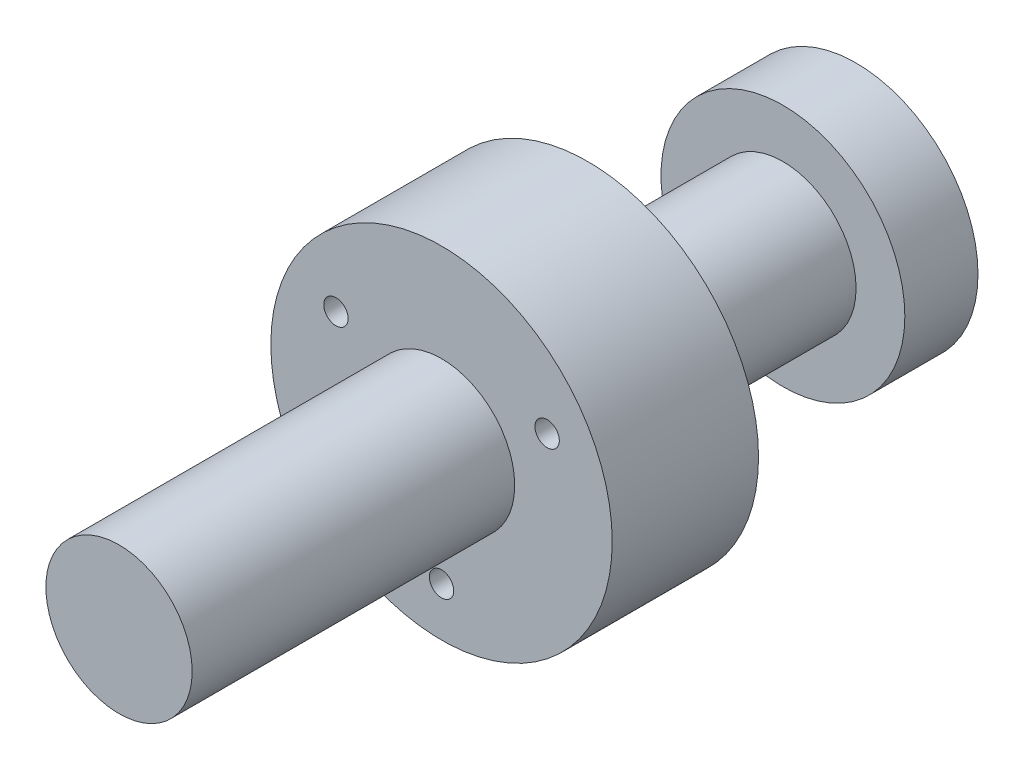
ISO-10303-21;
HEADER;
FILE_DESCRIPTION(('STEP AP214'),'2;1');
FILE_NAME('part.step','',(''),(''),'','','');
FILE_SCHEMA(('AUTOMOTIVE_DESIGN { 1 0 10303 214 1 1 1 1 }'));
ENDSEC;
DATA;
#1=APPLICATION_CONTEXT('core data for automotive mechanical design processes');
#2=APPLICATION_PROTOCOL_DEFINITION('international standard','automotive_design',2000,#1);
#3=PRODUCT_CONTEXT('',#1,'mechanical');
#4=PRODUCT('Part','Part','',(#3));
#5=PRODUCT_RELATED_PRODUCT_CATEGORY('part','',(#4));
#6=PRODUCT_DEFINITION_FORMATION('','',#4);
#7=PRODUCT_DEFINITION_CONTEXT('part definition',#1,'design');
#8=PRODUCT_DEFINITION('design','',#6,#7);
#9=PRODUCT_DEFINITION_SHAPE('','',#8);
#10=(LENGTH_UNIT() NAMED_UNIT(*) SI_UNIT(.MILLI.,.METRE.));
#11=(NAMED_UNIT(*) PLANE_ANGLE_UNIT() SI_UNIT($,.RADIAN.));
#12=(NAMED_UNIT(*) SI_UNIT($,.STERADIAN.) SOLID_ANGLE_UNIT());
#13=UNCERTAINTY_MEASURE_WITH_UNIT(LENGTH_MEASURE(1.E-05),#10,'distance_accuracy_value','');
#14=(GEOMETRIC_REPRESENTATION_CONTEXT(3) GLOBAL_UNCERTAINTY_ASSIGNED_CONTEXT((#13)) GLOBAL_UNIT_ASSIGNED_CONTEXT((#10,
#11,#12)) REPRESENTATION_CONTEXT('',''));
#15=CARTESIAN_POINT('',(0.,0.,0.));
#16=DIRECTION('',(0.,0.,1.));
#17=DIRECTION('',(1.,0.,0.));
#18=AXIS2_PLACEMENT_3D('',#15,#16,#17);
#19=CARTESIAN_POINT('',(0.,0.,33.5));
#20=DIRECTION('',(0.,0.,1.));
#21=DIRECTION('',(1.,0.,0.));
#22=AXIS2_PLACEMENT_3D('',#19,#20,#21);
#23=CYLINDRICAL_SURFACE('',#22,3.49999999999988);
#24=CARTESIAN_POINT('',(0.,0.,33.5));
#25=DIRECTION('',(0.,0.,1.));
#26=DIRECTION('',(1.,0.,0.));
#27=AXIS2_PLACEMENT_3D('',#24,#25,#26);
#28=CIRCLE('',#27,3.49999999999988);
#29=CARTESIAN_POINT('',(3.49999999999988,0.,33.5));
#30=VERTEX_POINT('',#29);
#31=EDGE_CURVE('E46',#30,#30,#28,.T.);
#32=ORIENTED_EDGE('',*,*,#31,.T.);
#33=EDGE_LOOP('',(#32));
#34=FACE_BOUND('',#33,.T.);
#35=CARTESIAN_POINT('',(0.,0.,36.5));
#36=DIRECTION('',(0.,0.,1.));
#37=DIRECTION('',(1.,0.,0.));
#38=AXIS2_PLACEMENT_3D('',#35,#36,#37);
#39=CIRCLE('',#38,3.49999999999988);
#40=CARTESIAN_POINT('',(3.49999999999988,0.,36.5));
#41=VERTEX_POINT('',#40);
#42=EDGE_CURVE('E51',#41,#41,#39,.T.);
#43=ORIENTED_EDGE('',*,*,#42,.F.);
#44=EDGE_LOOP('',(#43));
#45=FACE_BOUND('',#44,.T.);
#46=ADVANCED_FACE('F39',(#34,#45),#23,.T.);
#47=CARTESIAN_POINT('',(0.,0.,33.5));
#48=DIRECTION('',(0.,0.,1.));
#49=DIRECTION('',(1.,0.,0.));
#50=AXIS2_PLACEMENT_3D('',#47,#48,#49);
#51=PLANE('',#50);
#52=CARTESIAN_POINT('',(0.,-2.5,33.5));
#53=DIRECTION('',(0.,0.,1.));
#54=DIRECTION('',(1.,0.,0.));
#55=AXIS2_PLACEMENT_3D('',#52,#53,#54);
#56=CIRCLE('',#55,0.25);
#57=CARTESIAN_POINT('',(0.25,-2.5,33.5));
#58=VERTEX_POINT('',#57);
#59=EDGE_CURVE('E75',#58,#58,#56,.F.);
#60=ORIENTED_EDGE('',*,*,#59,.F.);
#61=EDGE_LOOP('',(#60));
#62=FACE_BOUND('',#61,.T.);
#63=CARTESIAN_POINT('',(-2.16506350946109,1.25000000000001,33.5));
#64=DIRECTION('',(0.,0.,1.));
#65=DIRECTION('',(1.,0.,0.));
#66=AXIS2_PLACEMENT_3D('',#63,#64,#65);
#67=CIRCLE('',#66,0.25);
#68=CARTESIAN_POINT('',(-1.91506350946109,1.25000000000001,33.5));
#69=VERTEX_POINT('',#68);
#70=EDGE_CURVE('E80',#69,#69,#67,.F.);
#71=ORIENTED_EDGE('',*,*,#70,.F.);
#72=EDGE_LOOP('',(#71));
#73=FACE_BOUND('',#72,.T.);
#74=CARTESIAN_POINT('',(2.16506350946111,1.24999999999998,33.5));
#75=DIRECTION('',(0.,0.,1.));
#76=DIRECTION('',(1.,0.,0.));
#77=AXIS2_PLACEMENT_3D('',#74,#75,#76);
#78=CIRCLE('',#77,0.250000000000001);
#79=CARTESIAN_POINT('',(2.41506350946111,1.24999999999998,33.5));
#80=VERTEX_POINT('',#79);
#81=EDGE_CURVE('E81',#80,#80,#78,.F.);
#82=ORIENTED_EDGE('',*,*,#81,.F.);
#83=EDGE_LOOP('',(#82));
#84=FACE_BOUND('',#83,.T.);
#85=CARTESIAN_POINT('',(0.,0.,33.5));
#86=DIRECTION('',(0.,0.,1.));
#87=DIRECTION('',(1.,0.,0.));
#88=AXIS2_PLACEMENT_3D('',#85,#86,#87);
#89=CIRCLE('',#88,1.5);
#90=CARTESIAN_POINT('',(1.5,0.,33.5));
#91=VERTEX_POINT('',#90);
#92=EDGE_CURVE('E10',#91,#91,#89,.F.);
#93=ORIENTED_EDGE('',*,*,#92,.F.);
#94=EDGE_LOOP('',(#93));
#95=FACE_BOUND('',#94,.T.);
#96=ORIENTED_EDGE('',*,*,#31,.F.);
#97=EDGE_LOOP('',(#96));
#98=FACE_BOUND('',#97,.T.);
#99=ADVANCED_FACE('F101',(#62,#73,#84,#95,#98),#51,.F.);
#100=CARTESIAN_POINT('',(0.,0.,36.5));
#101=DIRECTION('',(0.,0.,1.));
#102=DIRECTION('',(1.,0.,0.));
#103=AXIS2_PLACEMENT_3D('',#100,#101,#102);
#104=PLANE('',#103);
#105=CARTESIAN_POINT('',(0.,-2.5,36.5));
#106=DIRECTION('',(0.,0.,1.));
#107=DIRECTION('',(1.,0.,0.));
#108=AXIS2_PLACEMENT_3D('',#105,#106,#107);
#109=CIRCLE('',#108,0.25);
#110=CARTESIAN_POINT('',(0.25,-2.5,36.5));
#111=VERTEX_POINT('',#110);
#112=EDGE_CURVE('E87',#111,#111,#109,.T.);
#113=ORIENTED_EDGE('',*,*,#112,.F.);
#114=EDGE_LOOP('',(#113));
#115=FACE_BOUND('',#114,.T.);
#116=CARTESIAN_POINT('',(-2.16506350946109,1.25000000000001,36.5));
#117=DIRECTION('',(0.,0.,1.));
#118=DIRECTION('',(1.,0.,0.));
#119=AXIS2_PLACEMENT_3D('',#116,#117,#118);
#120=CIRCLE('',#119,0.25);
#121=CARTESIAN_POINT('',(-1.91506350946109,1.25000000000001,36.5));
#122=VERTEX_POINT('',#121);
#123=EDGE_CURVE('E84',#122,#122,#120,.T.);
#124=ORIENTED_EDGE('',*,*,#123,.F.);
#125=EDGE_LOOP('',(#124));
#126=FACE_BOUND('',#125,.T.);
#127=CARTESIAN_POINT('',(2.16506350946111,1.24999999999998,36.5));
#128=DIRECTION('',(0.,0.,1.));
#129=DIRECTION('',(1.,0.,0.));
#130=AXIS2_PLACEMENT_3D('',#127,#128,#129);
#131=CIRCLE('',#130,0.250000000000001);
#132=CARTESIAN_POINT('',(2.41506350946111,1.24999999999998,36.5));
#133=VERTEX_POINT('',#132);
#134=EDGE_CURVE('E77',#133,#133,#131,.T.);
#135=ORIENTED_EDGE('',*,*,#134,.F.);
#136=EDGE_LOOP('',(#135));
#137=FACE_BOUND('',#136,.T.);
#138=CARTESIAN_POINT('',(0.,0.,36.5));
#139=DIRECTION('',(0.,0.,1.));
#140=DIRECTION('',(1.,0.,0.));
#141=AXIS2_PLACEMENT_3D('',#138,#139,#140);
#142=CIRCLE('',#141,1.5);
#143=CARTESIAN_POINT('',(1.5,0.,36.5));
#144=VERTEX_POINT('',#143);
#145=EDGE_CURVE('E58',#144,#144,#142,.F.);
#146=ORIENTED_EDGE('',*,*,#145,.T.);
#147=EDGE_LOOP('',(#146));
#148=FACE_BOUND('',#147,.T.);
#149=ORIENTED_EDGE('',*,*,#42,.T.);
#150=EDGE_LOOP('',(#149));
#151=FACE_BOUND('',#150,.T.);
#152=ADVANCED_FACE('F97',(#115,#126,#137,#148,#151),#104,.T.);
#153=CARTESIAN_POINT('',(0.,0.,43.1129086455022));
#154=DIRECTION('',(0.,0.,1.));
#155=DIRECTION('',(1.,0.,0.));
#156=AXIS2_PLACEMENT_3D('',#153,#154,#155);
#157=PLANE('',#156);
#158=CARTESIAN_POINT('',(0.,0.,43.1129086455022));
#159=DIRECTION('',(0.,0.,1.));
#160=DIRECTION('',(1.,0.,0.));
#161=AXIS2_PLACEMENT_3D('',#158,#159,#160);
#162=CIRCLE('',#161,1.5);
#163=CARTESIAN_POINT('',(1.5,0.,43.1129086455022));
#164=VERTEX_POINT('',#163);
#165=EDGE_CURVE('E54',#164,#164,#162,.T.);
#166=ORIENTED_EDGE('',*,*,#165,.T.);
#167=EDGE_LOOP('',(#166));
#168=FACE_BOUND('',#167,.T.);
#169=ADVANCED_FACE('F100',(#168),#157,.T.);
#170=CARTESIAN_POINT('',(0.,0.,43.1129086455022));
#171=DIRECTION('',(0.,0.,-1.));
#172=DIRECTION('',(-1.,0.,0.));
#173=AXIS2_PLACEMENT_3D('',#170,#171,#172);
#174=CYLINDRICAL_SURFACE('',#173,1.5);
#175=ORIENTED_EDGE('',*,*,#145,.F.);
#176=EDGE_LOOP('',(#175));
#177=FACE_BOUND('',#176,.T.);
#178=ORIENTED_EDGE('',*,*,#165,.F.);
#179=EDGE_LOOP('',(#178));
#180=FACE_BOUND('',#179,.T.);
#181=ADVANCED_FACE('F124',(#177,#180),#174,.T.);
#182=CARTESIAN_POINT('',(0.,0.,29.5));
#183=DIRECTION('',(0.,0.,1.));
#184=DIRECTION('',(1.,0.,0.));
#185=AXIS2_PLACEMENT_3D('',#182,#183,#184);
#186=CIRCLE('',#185,1.5);
#187=CARTESIAN_POINT('',(1.5,0.,29.5));
#188=VERTEX_POINT('',#187);
#189=EDGE_CURVE('E42',#188,#188,#186,.T.);
#190=ORIENTED_EDGE('',*,*,#189,.T.);
#191=EDGE_LOOP('',(#190));
#192=FACE_BOUND('',#191,.T.);
#193=ORIENTED_EDGE('',*,*,#92,.T.);
#194=EDGE_LOOP('',(#193));
#195=FACE_BOUND('',#194,.T.);
#196=ADVANCED_FACE('F127',(#192,#195),#174,.T.);
#197=CARTESIAN_POINT('',(0.,0.,28.));
#198=DIRECTION('',(0.,0.,1.));
#199=DIRECTION('',(1.,0.,0.));
#200=AXIS2_PLACEMENT_3D('',#197,#198,#199);
#201=CYLINDRICAL_SURFACE('',#200,2.49999999999988);
#202=CARTESIAN_POINT('',(0.,0.,28.));
#203=DIRECTION('',(0.,0.,1.));
#204=DIRECTION('',(1.,0.,0.));
#205=AXIS2_PLACEMENT_3D('',#202,#203,#204);
#206=CIRCLE('',#205,2.49999999999988);
#207=CARTESIAN_POINT('',(2.49999999999988,0.,28.));
#208=VERTEX_POINT('',#207);
#209=EDGE_CURVE('E66',#208,#208,#206,.T.);
#210=ORIENTED_EDGE('',*,*,#209,.T.);
#211=EDGE_LOOP('',(#210));
#212=FACE_BOUND('',#211,.T.);
#213=CARTESIAN_POINT('',(0.,0.,29.5));
#214=DIRECTION('',(0.,0.,1.));
#215=DIRECTION('',(1.,0.,0.));
#216=AXIS2_PLACEMENT_3D('',#213,#214,#215);
#217=CIRCLE('',#216,2.49999999999988);
#218=CARTESIAN_POINT('',(2.49999999999988,0.,29.5));
#219=VERTEX_POINT('',#218);
#220=EDGE_CURVE('E70',#219,#219,#217,.T.);
#221=ORIENTED_EDGE('',*,*,#220,.F.);
#222=EDGE_LOOP('',(#221));
#223=FACE_BOUND('',#222,.T.);
#224=ADVANCED_FACE('F137',(#212,#223),#201,.T.);
#225=CARTESIAN_POINT('',(0.,0.,29.5));
#226=DIRECTION('',(0.,0.,1.));
#227=DIRECTION('',(1.,0.,0.));
#228=AXIS2_PLACEMENT_3D('',#225,#226,#227);
#229=PLANE('',#228);
#230=ORIENTED_EDGE('',*,*,#189,.F.);
#231=EDGE_LOOP('',(#230));
#232=FACE_BOUND('',#231,.T.);
#233=ORIENTED_EDGE('',*,*,#220,.T.);
#234=EDGE_LOOP('',(#233));
#235=FACE_BOUND('',#234,.T.);
#236=ADVANCED_FACE('F135',(#232,#235),#229,.T.);
#237=CARTESIAN_POINT('',(0.,0.,28.));
#238=DIRECTION('',(0.,0.,1.));
#239=DIRECTION('',(1.,0.,0.));
#240=AXIS2_PLACEMENT_3D('',#237,#238,#239);
#241=PLANE('',#240);
#242=ORIENTED_EDGE('',*,*,#209,.F.);
#243=EDGE_LOOP('',(#242));
#244=FACE_BOUND('',#243,.T.);
#245=ADVANCED_FACE('F131',(#244),#241,.F.);
#246=CARTESIAN_POINT('',(2.16506350946111,1.24999999999998,32.7928932188134));
#247=DIRECTION('',(0.,0.,1.));
#248=DIRECTION('',(1.,0.,0.));
#249=AXIS2_PLACEMENT_3D('',#246,#247,#248);
#250=CYLINDRICAL_SURFACE('',#249,0.250000000000001);
#251=ORIENTED_EDGE('',*,*,#81,.T.);
#252=EDGE_LOOP('',(#251));
#253=FACE_BOUND('',#252,.T.);
#254=ORIENTED_EDGE('',*,*,#134,.T.);
#255=EDGE_LOOP('',(#254));
#256=FACE_BOUND('',#255,.T.);
#257=ADVANCED_FACE('F134',(#253,#256),#250,.F.);
#258=CARTESIAN_POINT('',(-2.16506350946109,1.25000000000001,32.7928932188134));
#259=DIRECTION('',(0.,0.,1.));
#260=DIRECTION('',(1.,0.,0.));
#261=AXIS2_PLACEMENT_3D('',#258,#259,#260);
#262=CYLINDRICAL_SURFACE('',#261,0.25);
#263=ORIENTED_EDGE('',*,*,#70,.T.);
#264=EDGE_LOOP('',(#263));
#265=FACE_BOUND('',#264,.T.);
#266=ORIENTED_EDGE('',*,*,#123,.T.);
#267=EDGE_LOOP('',(#266));
#268=FACE_BOUND('',#267,.T.);
#269=ADVANCED_FACE('F145',(#265,#268),#262,.F.);
#270=CARTESIAN_POINT('',(0.,-2.5,32.7928932188134));
#271=DIRECTION('',(0.,0.,1.));
#272=DIRECTION('',(1.,0.,0.));
#273=AXIS2_PLACEMENT_3D('',#270,#271,#272);
#274=CYLINDRICAL_SURFACE('',#273,0.25);
#275=ORIENTED_EDGE('',*,*,#59,.T.);
#276=EDGE_LOOP('',(#275));
#277=FACE_BOUND('',#276,.T.);
#278=ORIENTED_EDGE('',*,*,#112,.T.);
#279=EDGE_LOOP('',(#278));
#280=FACE_BOUND('',#279,.T.);
#281=ADVANCED_FACE('F95',(#277,#280),#274,.F.);
#282=CLOSED_SHELL('',(#46,#99,#152,#169,#181,#196,#224,#236,#245,#257,#269,#281));
#283=MANIFOLD_SOLID_BREP('B2',#282);
#284=ADVANCED_BREP_SHAPE_REPRESENTATION('',(#18,#283),#14);
#285=SHAPE_DEFINITION_REPRESENTATION(#9,#284);
ENDSEC;
END-ISO-10303-21;
